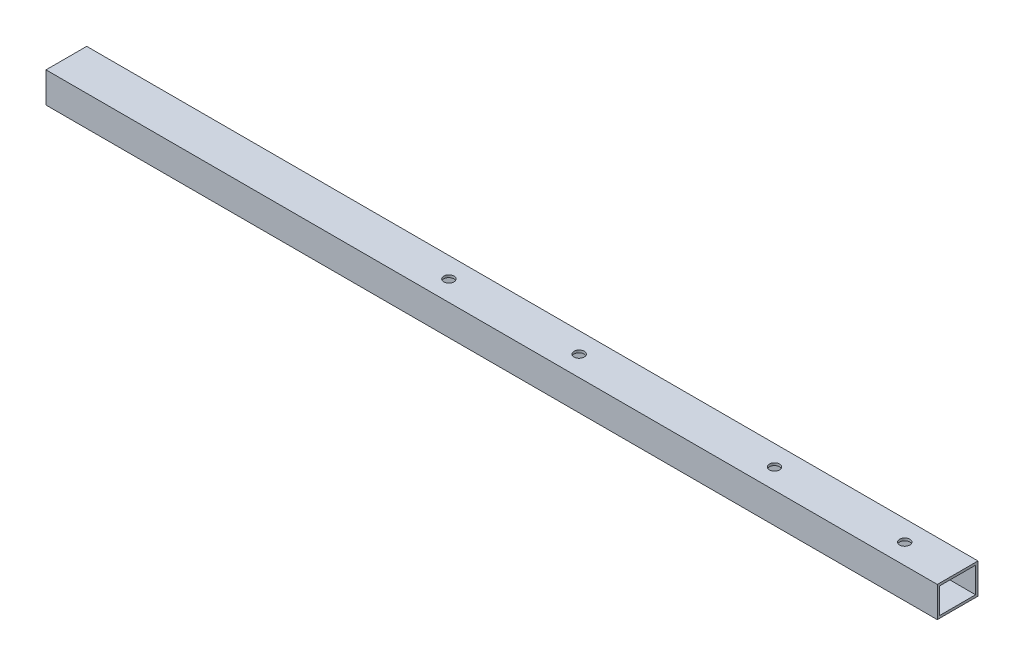
ISO-10303-21;
HEADER;
FILE_DESCRIPTION(('STEP AP214'),'2;1');
FILE_NAME('part.step','',(''),(''),'','','');
FILE_SCHEMA(('AUTOMOTIVE_DESIGN { 1 0 10303 214 1 1 1 1 }'));
ENDSEC;
DATA;
#1=APPLICATION_CONTEXT('core data for automotive mechanical design processes');
#2=APPLICATION_PROTOCOL_DEFINITION('international standard','automotive_design',2000,#1);
#3=PRODUCT_CONTEXT('',#1,'mechanical');
#4=PRODUCT('Part','Part','',(#3));
#5=PRODUCT_RELATED_PRODUCT_CATEGORY('part','',(#4));
#6=PRODUCT_DEFINITION_FORMATION('','',#4);
#7=PRODUCT_DEFINITION_CONTEXT('part definition',#1,'design');
#8=PRODUCT_DEFINITION('design','',#6,#7);
#9=PRODUCT_DEFINITION_SHAPE('','',#8);
#10=(LENGTH_UNIT() NAMED_UNIT(*) SI_UNIT(.MILLI.,.METRE.));
#11=(NAMED_UNIT(*) PLANE_ANGLE_UNIT() SI_UNIT($,.RADIAN.));
#12=(NAMED_UNIT(*) SI_UNIT($,.STERADIAN.) SOLID_ANGLE_UNIT());
#13=UNCERTAINTY_MEASURE_WITH_UNIT(LENGTH_MEASURE(1.E-05),#10,'distance_accuracy_value','');
#14=(GEOMETRIC_REPRESENTATION_CONTEXT(3) GLOBAL_UNCERTAINTY_ASSIGNED_CONTEXT((#13)) GLOBAL_UNIT_ASSIGNED_CONTEXT((#10,
#11,#12)) REPRESENTATION_CONTEXT('',''));
#15=CARTESIAN_POINT('',(0.,0.,0.));
#16=DIRECTION('',(0.,0.,1.));
#17=DIRECTION('',(1.,0.,0.));
#18=AXIS2_PLACEMENT_3D('',#15,#16,#17);
#19=CARTESIAN_POINT('',(438.,7.5,-10.));
#20=DIRECTION('',(0.,0.,1.));
#21=DIRECTION('',(0.,-1.,0.));
#22=AXIS2_PLACEMENT_3D('',#19,#20,#21);
#23=PLANE('',#22);
#24=DIRECTION('',(0.,1.,0.));
#25=VECTOR('',#24,1.);
#26=CARTESIAN_POINT('',(0.,7.5,-10.));
#27=LINE('',#26,#25);
#28=CARTESIAN_POINT('',(0.,-7.5,-10.));
#29=VERTEX_POINT('',#28);
#30=CARTESIAN_POINT('',(0.,7.5,-10.));
#31=VERTEX_POINT('',#30);
#32=EDGE_CURVE('E172',#29,#31,#27,.T.);
#33=ORIENTED_EDGE('',*,*,#32,.T.);
#34=DIRECTION('',(-1.,0.,0.));
#35=VECTOR('',#34,1.);
#36=CARTESIAN_POINT('',(438.,7.5,-10.));
#37=LINE('',#36,#35);
#38=CARTESIAN_POINT('',(438.,7.5,-10.));
#39=VERTEX_POINT('',#38);
#40=EDGE_CURVE('E12',#39,#31,#37,.T.);
#41=ORIENTED_EDGE('',*,*,#40,.F.);
#42=DIRECTION('',(0.,1.,0.));
#43=VECTOR('',#42,1.);
#44=CARTESIAN_POINT('',(438.,7.5,-10.));
#45=LINE('',#44,#43);
#46=CARTESIAN_POINT('',(438.,-7.5,-10.));
#47=VERTEX_POINT('',#46);
#48=EDGE_CURVE('E137',#47,#39,#45,.T.);
#49=ORIENTED_EDGE('',*,*,#48,.F.);
#50=DIRECTION('',(-1.,0.,0.));
#51=VECTOR('',#50,1.);
#52=CARTESIAN_POINT('',(438.,-7.5,-10.));
#53=LINE('',#52,#51);
#54=EDGE_CURVE('E183',#47,#29,#53,.T.);
#55=ORIENTED_EDGE('',*,*,#54,.T.);
#56=EDGE_LOOP('',(#33,#41,#49,#55));
#57=FACE_BOUND('',#56,.T.);
#58=ADVANCED_FACE('F55',(#57),#23,.F.);
#59=CARTESIAN_POINT('',(438.,7.5,10.));
#60=DIRECTION('',(0.,-1.,0.));
#61=DIRECTION('',(0.,0.,-1.));
#62=AXIS2_PLACEMENT_3D('',#59,#60,#61);
#63=PLANE('',#62);
#64=CARTESIAN_POINT('',(188.,7.5,0.));
#65=DIRECTION('',(0.,1.,0.));
#66=DIRECTION('',(0.,0.,1.));
#67=AXIS2_PLACEMENT_3D('',#64,#65,#66);
#68=CIRCLE('',#67,2.5);
#69=CARTESIAN_POINT('',(188.,7.5,2.5));
#70=VERTEX_POINT('',#69);
#71=EDGE_CURVE('E283',#70,#70,#68,.T.);
#72=ORIENTED_EDGE('',*,*,#71,.F.);
#73=EDGE_LOOP('',(#72));
#74=FACE_BOUND('',#73,.T.);
#75=CARTESIAN_POINT('',(252.,7.5,0.));
#76=DIRECTION('',(0.,1.,0.));
#77=DIRECTION('',(0.,0.,1.));
#78=AXIS2_PLACEMENT_3D('',#75,#76,#77);
#79=CIRCLE('',#78,2.50000000000002);
#80=CARTESIAN_POINT('',(252.,7.5,2.50000000000002));
#81=VERTEX_POINT('',#80);
#82=EDGE_CURVE('E275',#81,#81,#79,.T.);
#83=ORIENTED_EDGE('',*,*,#82,.F.);
#84=EDGE_LOOP('',(#83));
#85=FACE_BOUND('',#84,.T.);
#86=CARTESIAN_POINT('',(348.,7.5,0.));
#87=DIRECTION('',(0.,1.,0.));
#88=DIRECTION('',(0.,0.,1.));
#89=AXIS2_PLACEMENT_3D('',#86,#87,#88);
#90=CIRCLE('',#89,2.49999999999996);
#91=CARTESIAN_POINT('',(348.,7.5,2.49999999999996));
#92=VERTEX_POINT('',#91);
#93=EDGE_CURVE('E267',#92,#92,#90,.T.);
#94=ORIENTED_EDGE('',*,*,#93,.F.);
#95=EDGE_LOOP('',(#94));
#96=FACE_BOUND('',#95,.T.);
#97=CARTESIAN_POINT('',(412.,7.5,0.));
#98=DIRECTION('',(0.,1.,0.));
#99=DIRECTION('',(0.,0.,1.));
#100=AXIS2_PLACEMENT_3D('',#97,#98,#99);
#101=CIRCLE('',#100,2.50000000000002);
#102=CARTESIAN_POINT('',(412.,7.5,2.50000000000002));
#103=VERTEX_POINT('',#102);
#104=EDGE_CURVE('E259',#103,#103,#101,.T.);
#105=ORIENTED_EDGE('',*,*,#104,.F.);
#106=EDGE_LOOP('',(#105));
#107=FACE_BOUND('',#106,.T.);
#108=DIRECTION('',(0.,0.,1.));
#109=VECTOR('',#108,1.);
#110=CARTESIAN_POINT('',(0.,7.5,10.));
#111=LINE('',#110,#109);
#112=CARTESIAN_POINT('',(0.,7.5,10.));
#113=VERTEX_POINT('',#112);
#114=EDGE_CURVE('E143',#31,#113,#111,.T.);
#115=ORIENTED_EDGE('',*,*,#114,.T.);
#116=DIRECTION('',(-1.,0.,0.));
#117=VECTOR('',#116,1.);
#118=CARTESIAN_POINT('',(438.,7.5,10.));
#119=LINE('',#118,#117);
#120=CARTESIAN_POINT('',(438.,7.5,10.));
#121=VERTEX_POINT('',#120);
#122=EDGE_CURVE('E66',#121,#113,#119,.T.);
#123=ORIENTED_EDGE('',*,*,#122,.F.);
#124=DIRECTION('',(0.,0.,1.));
#125=VECTOR('',#124,1.);
#126=CARTESIAN_POINT('',(438.,7.5,10.));
#127=LINE('',#126,#125);
#128=EDGE_CURVE('E131',#39,#121,#127,.T.);
#129=ORIENTED_EDGE('',*,*,#128,.F.);
#130=ORIENTED_EDGE('',*,*,#40,.T.);
#131=EDGE_LOOP('',(#115,#123,#129,#130));
#132=FACE_BOUND('',#131,.T.);
#133=ADVANCED_FACE('F142',(#74,#85,#96,#107,#132),#63,.F.);
#134=CARTESIAN_POINT('',(438.,7.5,10.));
#135=DIRECTION('',(0.,0.,-1.));
#136=DIRECTION('',(0.,1.,0.));
#137=AXIS2_PLACEMENT_3D('',#134,#135,#136);
#138=PLANE('',#137);
#139=DIRECTION('',(0.,-1.,0.));
#140=VECTOR('',#139,1.);
#141=CARTESIAN_POINT('',(0.,7.5,10.));
#142=LINE('',#141,#140);
#143=CARTESIAN_POINT('',(0.,-7.5,10.));
#144=VERTEX_POINT('',#143);
#145=EDGE_CURVE('E104',#113,#144,#142,.T.);
#146=ORIENTED_EDGE('',*,*,#145,.T.);
#147=DIRECTION('',(-1.,0.,0.));
#148=VECTOR('',#147,1.);
#149=CARTESIAN_POINT('',(438.,-7.5,10.));
#150=LINE('',#149,#148);
#151=CARTESIAN_POINT('',(438.,-7.5,10.));
#152=VERTEX_POINT('',#151);
#153=EDGE_CURVE('E145',#152,#144,#150,.T.);
#154=ORIENTED_EDGE('',*,*,#153,.F.);
#155=DIRECTION('',(0.,-1.,0.));
#156=VECTOR('',#155,1.);
#157=CARTESIAN_POINT('',(438.,7.5,10.));
#158=LINE('',#157,#156);
#159=EDGE_CURVE('E135',#121,#152,#158,.T.);
#160=ORIENTED_EDGE('',*,*,#159,.F.);
#161=ORIENTED_EDGE('',*,*,#122,.T.);
#162=EDGE_LOOP('',(#146,#154,#160,#161));
#163=FACE_BOUND('',#162,.T.);
#164=ADVANCED_FACE('F147',(#163),#138,.F.);
#165=CARTESIAN_POINT('',(438.,6.3,8.8));
#166=DIRECTION('',(0.,0.,-1.));
#167=DIRECTION('',(0.,1.,0.));
#168=AXIS2_PLACEMENT_3D('',#165,#166,#167);
#169=PLANE('',#168);
#170=DIRECTION('',(0.,-1.,0.));
#171=VECTOR('',#170,1.);
#172=CARTESIAN_POINT('',(0.,6.3,8.8));
#173=LINE('',#172,#171);
#174=CARTESIAN_POINT('',(0.,6.3,8.8));
#175=VERTEX_POINT('',#174);
#176=CARTESIAN_POINT('',(0.,-6.3,8.8));
#177=VERTEX_POINT('',#176);
#178=EDGE_CURVE('E155',#175,#177,#173,.T.);
#179=ORIENTED_EDGE('',*,*,#178,.F.);
#180=DIRECTION('',(-1.,0.,0.));
#181=VECTOR('',#180,1.);
#182=CARTESIAN_POINT('',(438.,6.3,8.8));
#183=LINE('',#182,#181);
#184=CARTESIAN_POINT('',(438.,6.3,8.8));
#185=VERTEX_POINT('',#184);
#186=EDGE_CURVE('E59',#185,#175,#183,.T.);
#187=ORIENTED_EDGE('',*,*,#186,.F.);
#188=DIRECTION('',(0.,-1.,0.));
#189=VECTOR('',#188,1.);
#190=CARTESIAN_POINT('',(438.,6.3,8.8));
#191=LINE('',#190,#189);
#192=CARTESIAN_POINT('',(438.,-6.3,8.8));
#193=VERTEX_POINT('',#192);
#194=EDGE_CURVE('E182',#185,#193,#191,.T.);
#195=ORIENTED_EDGE('',*,*,#194,.T.);
#196=DIRECTION('',(-1.,0.,0.));
#197=VECTOR('',#196,1.);
#198=CARTESIAN_POINT('',(438.,-6.3,8.8));
#199=LINE('',#198,#197);
#200=EDGE_CURVE('E151',#193,#177,#199,.T.);
#201=ORIENTED_EDGE('',*,*,#200,.T.);
#202=EDGE_LOOP('',(#179,#187,#195,#201));
#203=FACE_BOUND('',#202,.T.);
#204=ADVANCED_FACE('F57',(#203),#169,.T.);
#205=CARTESIAN_POINT('',(438.,6.3,8.8));
#206=DIRECTION('',(0.,-1.,0.));
#207=DIRECTION('',(0.,0.,-1.));
#208=AXIS2_PLACEMENT_3D('',#205,#206,#207);
#209=PLANE('',#208);
#210=CARTESIAN_POINT('',(188.,6.3,0.));
#211=DIRECTION('',(0.,-1.,0.));
#212=DIRECTION('',(0.,0.,-1.));
#213=AXIS2_PLACEMENT_3D('',#210,#211,#212);
#214=CIRCLE('',#213,2.5);
#215=CARTESIAN_POINT('',(188.,6.3,-2.5));
#216=VERTEX_POINT('',#215);
#217=EDGE_CURVE('E160',#216,#216,#214,.T.);
#218=ORIENTED_EDGE('',*,*,#217,.F.);
#219=EDGE_LOOP('',(#218));
#220=FACE_BOUND('',#219,.T.);
#221=CARTESIAN_POINT('',(252.,6.3,0.));
#222=DIRECTION('',(0.,-1.,0.));
#223=DIRECTION('',(0.,0.,-1.));
#224=AXIS2_PLACEMENT_3D('',#221,#222,#223);
#225=CIRCLE('',#224,2.50000000000002);
#226=CARTESIAN_POINT('',(252.,6.3,-2.50000000000002));
#227=VERTEX_POINT('',#226);
#228=EDGE_CURVE('E234',#227,#227,#225,.T.);
#229=ORIENTED_EDGE('',*,*,#228,.F.);
#230=EDGE_LOOP('',(#229));
#231=FACE_BOUND('',#230,.T.);
#232=CARTESIAN_POINT('',(348.,6.3,0.));
#233=DIRECTION('',(0.,-1.,0.));
#234=DIRECTION('',(0.,0.,-1.));
#235=AXIS2_PLACEMENT_3D('',#232,#233,#234);
#236=CIRCLE('',#235,2.49999999999996);
#237=CARTESIAN_POINT('',(348.,6.3,-2.49999999999996));
#238=VERTEX_POINT('',#237);
#239=EDGE_CURVE('E242',#238,#238,#236,.T.);
#240=ORIENTED_EDGE('',*,*,#239,.F.);
#241=EDGE_LOOP('',(#240));
#242=FACE_BOUND('',#241,.T.);
#243=CARTESIAN_POINT('',(412.,6.3,0.));
#244=DIRECTION('',(0.,-1.,0.));
#245=DIRECTION('',(0.,0.,-1.));
#246=AXIS2_PLACEMENT_3D('',#243,#244,#245);
#247=CIRCLE('',#246,2.50000000000002);
#248=CARTESIAN_POINT('',(412.,6.3,-2.50000000000002));
#249=VERTEX_POINT('',#248);
#250=EDGE_CURVE('E250',#249,#249,#247,.T.);
#251=ORIENTED_EDGE('',*,*,#250,.F.);
#252=EDGE_LOOP('',(#251));
#253=FACE_BOUND('',#252,.T.);
#254=DIRECTION('',(0.,0.,1.));
#255=VECTOR('',#254,1.);
#256=CARTESIAN_POINT('',(0.,6.3,8.8));
#257=LINE('',#256,#255);
#258=CARTESIAN_POINT('',(0.,6.3,-8.8));
#259=VERTEX_POINT('',#258);
#260=EDGE_CURVE('E159',#259,#175,#257,.T.);
#261=ORIENTED_EDGE('',*,*,#260,.F.);
#262=DIRECTION('',(-1.,0.,0.));
#263=VECTOR('',#262,1.);
#264=CARTESIAN_POINT('',(438.,6.3,-8.8));
#265=LINE('',#264,#263);
#266=CARTESIAN_POINT('',(438.,6.3,-8.8));
#267=VERTEX_POINT('',#266);
#268=EDGE_CURVE('E192',#267,#259,#265,.T.);
#269=ORIENTED_EDGE('',*,*,#268,.F.);
#270=DIRECTION('',(0.,0.,1.));
#271=VECTOR('',#270,1.);
#272=CARTESIAN_POINT('',(438.,6.3,8.8));
#273=LINE('',#272,#271);
#274=EDGE_CURVE('E203',#267,#185,#273,.T.);
#275=ORIENTED_EDGE('',*,*,#274,.T.);
#276=ORIENTED_EDGE('',*,*,#186,.T.);
#277=EDGE_LOOP('',(#261,#269,#275,#276));
#278=FACE_BOUND('',#277,.T.);
#279=ADVANCED_FACE('F201',(#220,#231,#242,#253,#278),#209,.T.);
#280=CARTESIAN_POINT('',(438.,6.3,-8.8));
#281=DIRECTION('',(0.,0.,1.));
#282=DIRECTION('',(1.,0.,0.));
#283=AXIS2_PLACEMENT_3D('',#280,#281,#282);
#284=PLANE('',#283);
#285=DIRECTION('',(0.,1.,0.));
#286=VECTOR('',#285,1.);
#287=CARTESIAN_POINT('',(0.,6.3,-8.8));
#288=LINE('',#287,#286);
#289=CARTESIAN_POINT('',(0.,-6.3,-8.8));
#290=VERTEX_POINT('',#289);
#291=EDGE_CURVE('E164',#290,#259,#288,.T.);
#292=ORIENTED_EDGE('',*,*,#291,.F.);
#293=DIRECTION('',(-1.,0.,0.));
#294=VECTOR('',#293,1.);
#295=CARTESIAN_POINT('',(438.,-6.3,-8.8));
#296=LINE('',#295,#294);
#297=CARTESIAN_POINT('',(438.,-6.3,-8.8));
#298=VERTEX_POINT('',#297);
#299=EDGE_CURVE('E190',#298,#290,#296,.T.);
#300=ORIENTED_EDGE('',*,*,#299,.F.);
#301=DIRECTION('',(0.,1.,0.));
#302=VECTOR('',#301,1.);
#303=CARTESIAN_POINT('',(438.,6.3,-8.8));
#304=LINE('',#303,#302);
#305=EDGE_CURVE('E210',#298,#267,#304,.T.);
#306=ORIENTED_EDGE('',*,*,#305,.T.);
#307=ORIENTED_EDGE('',*,*,#268,.T.);
#308=EDGE_LOOP('',(#292,#300,#306,#307));
#309=FACE_BOUND('',#308,.T.);
#310=ADVANCED_FACE('F208',(#309),#284,.T.);
#311=CARTESIAN_POINT('',(438.,-6.3,8.8));
#312=DIRECTION('',(0.,1.,0.));
#313=DIRECTION('',(0.,0.,1.));
#314=AXIS2_PLACEMENT_3D('',#311,#312,#313);
#315=PLANE('',#314);
#316=CARTESIAN_POINT('',(188.,-6.3,0.));
#317=DIRECTION('',(0.,1.,0.));
#318=DIRECTION('',(0.,0.,1.));
#319=AXIS2_PLACEMENT_3D('',#316,#317,#318);
#320=CIRCLE('',#319,2.5);
#321=CARTESIAN_POINT('',(188.,-6.3,2.5));
#322=VERTEX_POINT('',#321);
#323=EDGE_CURVE('E230',#322,#322,#320,.T.);
#324=ORIENTED_EDGE('',*,*,#323,.F.);
#325=EDGE_LOOP('',(#324));
#326=FACE_BOUND('',#325,.T.);
#327=CARTESIAN_POINT('',(252.,-6.3,0.));
#328=DIRECTION('',(0.,1.,0.));
#329=DIRECTION('',(0.,0.,1.));
#330=AXIS2_PLACEMENT_3D('',#327,#328,#329);
#331=CIRCLE('',#330,2.50000000000002);
#332=CARTESIAN_POINT('',(252.,-6.3,2.50000000000002));
#333=VERTEX_POINT('',#332);
#334=EDGE_CURVE('E238',#333,#333,#331,.T.);
#335=ORIENTED_EDGE('',*,*,#334,.F.);
#336=EDGE_LOOP('',(#335));
#337=FACE_BOUND('',#336,.T.);
#338=CARTESIAN_POINT('',(348.,-6.3,0.));
#339=DIRECTION('',(0.,1.,0.));
#340=DIRECTION('',(0.,0.,1.));
#341=AXIS2_PLACEMENT_3D('',#338,#339,#340);
#342=CIRCLE('',#341,2.49999999999996);
#343=CARTESIAN_POINT('',(348.,-6.3,2.49999999999996));
#344=VERTEX_POINT('',#343);
#345=EDGE_CURVE('E246',#344,#344,#342,.T.);
#346=ORIENTED_EDGE('',*,*,#345,.F.);
#347=EDGE_LOOP('',(#346));
#348=FACE_BOUND('',#347,.T.);
#349=CARTESIAN_POINT('',(412.,-6.3,0.));
#350=DIRECTION('',(0.,1.,0.));
#351=DIRECTION('',(0.,0.,1.));
#352=AXIS2_PLACEMENT_3D('',#349,#350,#351);
#353=CIRCLE('',#352,2.50000000000002);
#354=CARTESIAN_POINT('',(412.,-6.3,2.50000000000002));
#355=VERTEX_POINT('',#354);
#356=EDGE_CURVE('E254',#355,#355,#353,.T.);
#357=ORIENTED_EDGE('',*,*,#356,.F.);
#358=EDGE_LOOP('',(#357));
#359=FACE_BOUND('',#358,.T.);
#360=DIRECTION('',(0.,0.,-1.));
#361=VECTOR('',#360,1.);
#362=CARTESIAN_POINT('',(0.,-6.3,8.8));
#363=LINE('',#362,#361);
#364=EDGE_CURVE('E168',#177,#290,#363,.T.);
#365=ORIENTED_EDGE('',*,*,#364,.F.);
#366=ORIENTED_EDGE('',*,*,#200,.F.);
#367=DIRECTION('',(0.,0.,-1.));
#368=VECTOR('',#367,1.);
#369=CARTESIAN_POINT('',(438.,-6.3,8.8));
#370=LINE('',#369,#368);
#371=EDGE_CURVE('E215',#193,#298,#370,.T.);
#372=ORIENTED_EDGE('',*,*,#371,.T.);
#373=ORIENTED_EDGE('',*,*,#299,.T.);
#374=EDGE_LOOP('',(#365,#366,#372,#373));
#375=FACE_BOUND('',#374,.T.);
#376=ADVANCED_FACE('F218',(#326,#337,#348,#359,#375),#315,.T.);
#377=CARTESIAN_POINT('',(438.,-7.5,10.));
#378=DIRECTION('',(0.,1.,0.));
#379=DIRECTION('',(0.,0.,1.));
#380=AXIS2_PLACEMENT_3D('',#377,#378,#379);
#381=PLANE('',#380);
#382=CARTESIAN_POINT('',(188.,-7.5,0.));
#383=DIRECTION('',(0.,1.,0.));
#384=DIRECTION('',(0.,0.,1.));
#385=AXIS2_PLACEMENT_3D('',#382,#383,#384);
#386=CIRCLE('',#385,2.5);
#387=CARTESIAN_POINT('',(188.,-7.5,2.5));
#388=VERTEX_POINT('',#387);
#389=EDGE_CURVE('E258',#388,#388,#386,.T.);
#390=ORIENTED_EDGE('',*,*,#389,.T.);
#391=EDGE_LOOP('',(#390));
#392=FACE_BOUND('',#391,.T.);
#393=CARTESIAN_POINT('',(252.,-7.5,0.));
#394=DIRECTION('',(0.,1.,0.));
#395=DIRECTION('',(0.,0.,1.));
#396=AXIS2_PLACEMENT_3D('',#393,#394,#395);
#397=CIRCLE('',#396,2.50000000000002);
#398=CARTESIAN_POINT('',(252.,-7.5,2.50000000000002));
#399=VERTEX_POINT('',#398);
#400=EDGE_CURVE('E279',#399,#399,#397,.T.);
#401=ORIENTED_EDGE('',*,*,#400,.T.);
#402=EDGE_LOOP('',(#401));
#403=FACE_BOUND('',#402,.T.);
#404=CARTESIAN_POINT('',(348.,-7.5,0.));
#405=DIRECTION('',(0.,1.,0.));
#406=DIRECTION('',(0.,0.,1.));
#407=AXIS2_PLACEMENT_3D('',#404,#405,#406);
#408=CIRCLE('',#407,2.49999999999996);
#409=CARTESIAN_POINT('',(348.,-7.5,2.49999999999996));
#410=VERTEX_POINT('',#409);
#411=EDGE_CURVE('E271',#410,#410,#408,.T.);
#412=ORIENTED_EDGE('',*,*,#411,.T.);
#413=EDGE_LOOP('',(#412));
#414=FACE_BOUND('',#413,.T.);
#415=CARTESIAN_POINT('',(412.,-7.5,0.));
#416=DIRECTION('',(0.,1.,0.));
#417=DIRECTION('',(0.,0.,1.));
#418=AXIS2_PLACEMENT_3D('',#415,#416,#417);
#419=CIRCLE('',#418,2.50000000000002);
#420=CARTESIAN_POINT('',(412.,-7.5,2.50000000000002));
#421=VERTEX_POINT('',#420);
#422=EDGE_CURVE('E263',#421,#421,#419,.T.);
#423=ORIENTED_EDGE('',*,*,#422,.T.);
#424=EDGE_LOOP('',(#423));
#425=FACE_BOUND('',#424,.T.);
#426=DIRECTION('',(0.,0.,-1.));
#427=VECTOR('',#426,1.);
#428=CARTESIAN_POINT('',(0.,-7.5,10.));
#429=LINE('',#428,#427);
#430=EDGE_CURVE('E110',#144,#29,#429,.T.);
#431=ORIENTED_EDGE('',*,*,#430,.T.);
#432=ORIENTED_EDGE('',*,*,#54,.F.);
#433=DIRECTION('',(0.,0.,-1.));
#434=VECTOR('',#433,1.);
#435=CARTESIAN_POINT('',(438.,-7.5,10.));
#436=LINE('',#435,#434);
#437=EDGE_CURVE('E75',#152,#47,#436,.T.);
#438=ORIENTED_EDGE('',*,*,#437,.F.);
#439=ORIENTED_EDGE('',*,*,#153,.T.);
#440=EDGE_LOOP('',(#431,#432,#438,#439));
#441=FACE_BOUND('',#440,.T.);
#442=ADVANCED_FACE('F291',(#392,#403,#414,#425,#441),#381,.F.);
#443=CARTESIAN_POINT('',(438.,0.,0.));
#444=DIRECTION('',(1.,0.,0.));
#445=DIRECTION('',(0.,0.,-1.));
#446=AXIS2_PLACEMENT_3D('',#443,#444,#445);
#447=PLANE('',#446);
#448=ORIENTED_EDGE('',*,*,#194,.F.);
#449=ORIENTED_EDGE('',*,*,#274,.F.);
#450=ORIENTED_EDGE('',*,*,#305,.F.);
#451=ORIENTED_EDGE('',*,*,#371,.F.);
#452=EDGE_LOOP('',(#448,#449,#450,#451));
#453=FACE_BOUND('',#452,.T.);
#454=ORIENTED_EDGE('',*,*,#48,.T.);
#455=ORIENTED_EDGE('',*,*,#128,.T.);
#456=ORIENTED_EDGE('',*,*,#159,.T.);
#457=ORIENTED_EDGE('',*,*,#437,.T.);
#458=EDGE_LOOP('',(#454,#455,#456,#457));
#459=FACE_BOUND('',#458,.T.);
#460=ADVANCED_FACE('F133',(#453,#459),#447,.T.);
#461=CARTESIAN_POINT('',(0.,0.,0.));
#462=DIRECTION('',(1.,0.,0.));
#463=DIRECTION('',(0.,0.,-1.));
#464=AXIS2_PLACEMENT_3D('',#461,#462,#463);
#465=PLANE('',#464);
#466=ORIENTED_EDGE('',*,*,#178,.T.);
#467=ORIENTED_EDGE('',*,*,#364,.T.);
#468=ORIENTED_EDGE('',*,*,#291,.T.);
#469=ORIENTED_EDGE('',*,*,#260,.T.);
#470=EDGE_LOOP('',(#466,#467,#468,#469));
#471=FACE_BOUND('',#470,.T.);
#472=ORIENTED_EDGE('',*,*,#32,.F.);
#473=ORIENTED_EDGE('',*,*,#430,.F.);
#474=ORIENTED_EDGE('',*,*,#145,.F.);
#475=ORIENTED_EDGE('',*,*,#114,.F.);
#476=EDGE_LOOP('',(#472,#473,#474,#475));
#477=FACE_BOUND('',#476,.T.);
#478=ADVANCED_FACE('F206',(#471,#477),#465,.F.);
#479=CARTESIAN_POINT('',(412.,-7.5,0.));
#480=DIRECTION('',(0.,1.,0.));
#481=DIRECTION('',(0.,0.,1.));
#482=AXIS2_PLACEMENT_3D('',#479,#480,#481);
#483=CYLINDRICAL_SURFACE('',#482,2.50000000000002);
#484=ORIENTED_EDGE('',*,*,#356,.T.);
#485=EDGE_LOOP('',(#484));
#486=FACE_BOUND('',#485,.T.);
#487=ORIENTED_EDGE('',*,*,#422,.F.);
#488=EDGE_LOOP('',(#487));
#489=FACE_BOUND('',#488,.T.);
#490=ADVANCED_FACE('F308',(#486,#489),#483,.F.);
#491=CARTESIAN_POINT('',(348.,-7.5,0.));
#492=DIRECTION('',(0.,1.,0.));
#493=DIRECTION('',(0.,0.,1.));
#494=AXIS2_PLACEMENT_3D('',#491,#492,#493);
#495=CYLINDRICAL_SURFACE('',#494,2.49999999999996);
#496=ORIENTED_EDGE('',*,*,#345,.T.);
#497=EDGE_LOOP('',(#496));
#498=FACE_BOUND('',#497,.T.);
#499=ORIENTED_EDGE('',*,*,#411,.F.);
#500=EDGE_LOOP('',(#499));
#501=FACE_BOUND('',#500,.T.);
#502=ADVANCED_FACE('F309',(#498,#501),#495,.F.);
#503=CARTESIAN_POINT('',(252.,-7.5,0.));
#504=DIRECTION('',(0.,1.,0.));
#505=DIRECTION('',(0.,0.,1.));
#506=AXIS2_PLACEMENT_3D('',#503,#504,#505);
#507=CYLINDRICAL_SURFACE('',#506,2.50000000000002);
#508=ORIENTED_EDGE('',*,*,#334,.T.);
#509=EDGE_LOOP('',(#508));
#510=FACE_BOUND('',#509,.T.);
#511=ORIENTED_EDGE('',*,*,#400,.F.);
#512=EDGE_LOOP('',(#511));
#513=FACE_BOUND('',#512,.T.);
#514=ADVANCED_FACE('F297',(#510,#513),#507,.F.);
#515=CARTESIAN_POINT('',(188.,-7.5,0.));
#516=DIRECTION('',(0.,1.,0.));
#517=DIRECTION('',(0.,0.,1.));
#518=AXIS2_PLACEMENT_3D('',#515,#516,#517);
#519=CYLINDRICAL_SURFACE('',#518,2.5);
#520=ORIENTED_EDGE('',*,*,#323,.T.);
#521=EDGE_LOOP('',(#520));
#522=FACE_BOUND('',#521,.T.);
#523=ORIENTED_EDGE('',*,*,#389,.F.);
#524=EDGE_LOOP('',(#523));
#525=FACE_BOUND('',#524,.T.);
#526=ADVANCED_FACE('F294',(#522,#525),#519,.F.);
#527=ORIENTED_EDGE('',*,*,#250,.T.);
#528=EDGE_LOOP('',(#527));
#529=FACE_BOUND('',#528,.T.);
#530=ORIENTED_EDGE('',*,*,#104,.T.);
#531=EDGE_LOOP('',(#530));
#532=FACE_BOUND('',#531,.T.);
#533=ADVANCED_FACE('F296',(#529,#532),#483,.F.);
#534=ORIENTED_EDGE('',*,*,#239,.T.);
#535=EDGE_LOOP('',(#534));
#536=FACE_BOUND('',#535,.T.);
#537=ORIENTED_EDGE('',*,*,#93,.T.);
#538=EDGE_LOOP('',(#537));
#539=FACE_BOUND('',#538,.T.);
#540=ADVANCED_FACE('F305',(#536,#539),#495,.F.);
#541=ORIENTED_EDGE('',*,*,#228,.T.);
#542=EDGE_LOOP('',(#541));
#543=FACE_BOUND('',#542,.T.);
#544=ORIENTED_EDGE('',*,*,#82,.T.);
#545=EDGE_LOOP('',(#544));
#546=FACE_BOUND('',#545,.T.);
#547=ADVANCED_FACE('F312',(#543,#546),#507,.F.);
#548=ORIENTED_EDGE('',*,*,#217,.T.);
#549=EDGE_LOOP('',(#548));
#550=FACE_BOUND('',#549,.T.);
#551=ORIENTED_EDGE('',*,*,#71,.T.);
#552=EDGE_LOOP('',(#551));
#553=FACE_BOUND('',#552,.T.);
#554=ADVANCED_FACE('F300',(#550,#553),#519,.F.);
#555=CLOSED_SHELL('',(#58,#133,#164,#204,#279,#310,#376,#442,#460,#478,#490,#502,#514,#526,#533,
#540,#547,#554));
#556=MANIFOLD_SOLID_BREP('B2',#555);
#557=ADVANCED_BREP_SHAPE_REPRESENTATION('',(#18,#556),#14);
#558=SHAPE_DEFINITION_REPRESENTATION(#9,#557);
ENDSEC;
END-ISO-10303-21;
